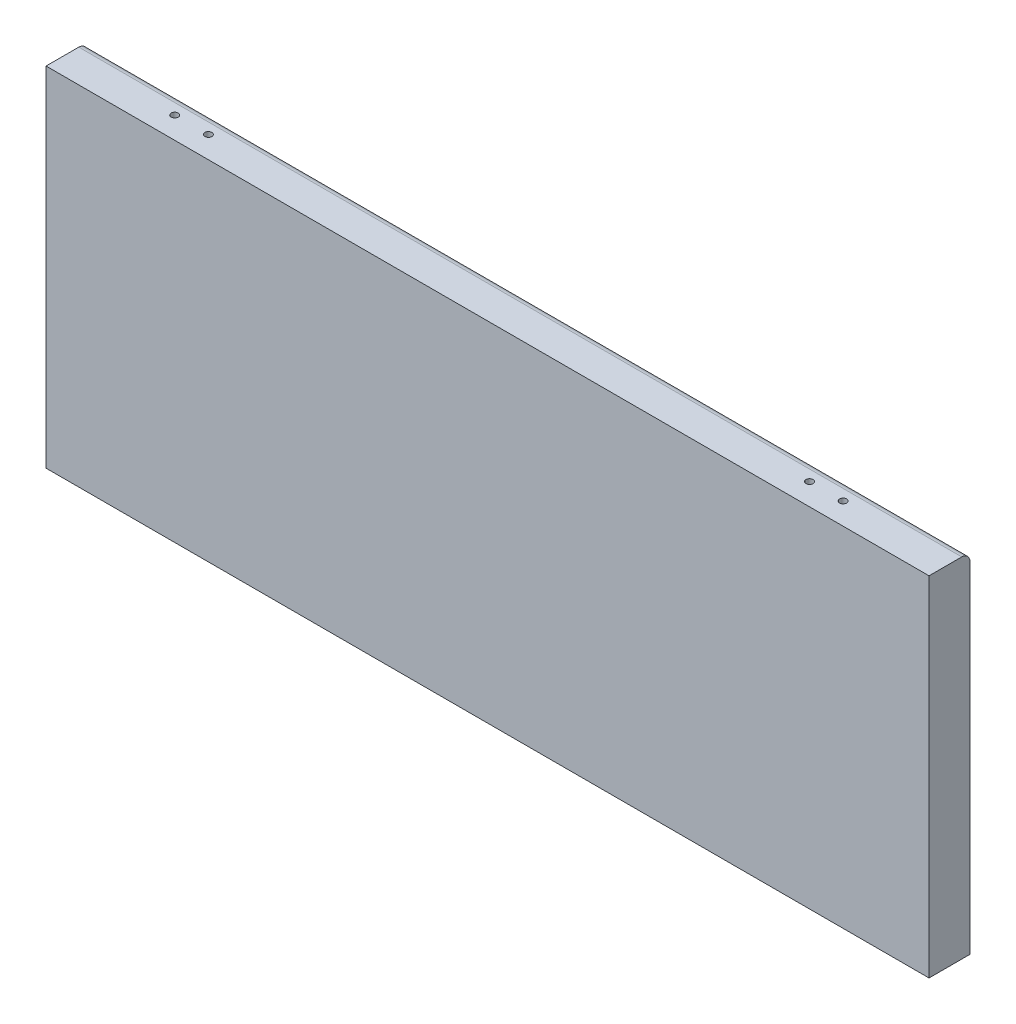
ISO-10303-21;
HEADER;
FILE_DESCRIPTION(('STEP AP214'),'2;1');
FILE_NAME('part.step','',(''),(''),'','','');
FILE_SCHEMA(('AUTOMOTIVE_DESIGN { 1 0 10303 214 1 1 1 1 }'));
ENDSEC;
DATA;
#1=APPLICATION_CONTEXT('core data for automotive mechanical design processes');
#2=APPLICATION_PROTOCOL_DEFINITION('international standard','automotive_design',2000,#1);
#3=PRODUCT_CONTEXT('',#1,'mechanical');
#4=PRODUCT('Part','Part','',(#3));
#5=PRODUCT_RELATED_PRODUCT_CATEGORY('part','',(#4));
#6=PRODUCT_DEFINITION_FORMATION('','',#4);
#7=PRODUCT_DEFINITION_CONTEXT('part definition',#1,'design');
#8=PRODUCT_DEFINITION('design','',#6,#7);
#9=PRODUCT_DEFINITION_SHAPE('','',#8);
#10=(LENGTH_UNIT() NAMED_UNIT(*) SI_UNIT(.MILLI.,.METRE.));
#11=(NAMED_UNIT(*) PLANE_ANGLE_UNIT() SI_UNIT($,.RADIAN.));
#12=(NAMED_UNIT(*) SI_UNIT($,.STERADIAN.) SOLID_ANGLE_UNIT());
#13=UNCERTAINTY_MEASURE_WITH_UNIT(LENGTH_MEASURE(1.E-05),#10,'distance_accuracy_value','');
#14=(GEOMETRIC_REPRESENTATION_CONTEXT(3) GLOBAL_UNCERTAINTY_ASSIGNED_CONTEXT((#13)) GLOBAL_UNIT_ASSIGNED_CONTEXT((#10,
#11,#12)) REPRESENTATION_CONTEXT('',''));
#15=CARTESIAN_POINT('',(0.,0.,0.));
#16=DIRECTION('',(0.,0.,1.));
#17=DIRECTION('',(1.,0.,0.));
#18=AXIS2_PLACEMENT_3D('',#15,#16,#17);
#19=CARTESIAN_POINT('',(358.321339930758,127.712624425195,-76.));
#20=DIRECTION('',(-1.,0.,0.));
#21=DIRECTION('',(0.,0.,1.));
#22=AXIS2_PLACEMENT_3D('',#19,#20,#21);
#23=PLANE('',#22);
#24=DIRECTION('',(0.,1.,0.));
#25=VECTOR('',#24,1.);
#26=CARTESIAN_POINT('',(358.321339930758,127.712624425195,-91.));
#27=LINE('',#26,#25);
#28=CARTESIAN_POINT('',(358.321339930758,0.,-91.));
#29=VERTEX_POINT('',#28);
#30=CARTESIAN_POINT('',(358.321339930758,124.712624425195,-91.));
#31=VERTEX_POINT('',#30);
#32=EDGE_CURVE('E150',#29,#31,#27,.T.);
#33=ORIENTED_EDGE('',*,*,#32,.T.);
#34=CARTESIAN_POINT('',(358.321339930758,124.712624425195,-88.));
#35=DIRECTION('',(-1.,0.,0.));
#36=DIRECTION('',(0.,0.,1.));
#37=AXIS2_PLACEMENT_3D('',#34,#35,#36);
#38=CIRCLE('',#37,3.);
#39=CARTESIAN_POINT('',(358.321339930758,127.712624425195,-88.));
#40=VERTEX_POINT('',#39);
#41=EDGE_CURVE('E11',#31,#40,#38,.F.);
#42=ORIENTED_EDGE('',*,*,#41,.T.);
#43=DIRECTION('',(0.,0.,-1.));
#44=VECTOR('',#43,1.);
#45=CARTESIAN_POINT('',(358.321339930758,127.712624425195,-76.));
#46=LINE('',#45,#44);
#47=CARTESIAN_POINT('',(358.321339930758,127.712624425195,-76.));
#48=VERTEX_POINT('',#47);
#49=EDGE_CURVE('E168',#48,#40,#46,.T.);
#50=ORIENTED_EDGE('',*,*,#49,.F.);
#51=DIRECTION('',(0.,1.,0.));
#52=VECTOR('',#51,1.);
#53=CARTESIAN_POINT('',(358.321339930758,127.712624425195,-76.));
#54=LINE('',#53,#52);
#55=CARTESIAN_POINT('',(358.321339930758,0.,-76.));
#56=VERTEX_POINT('',#55);
#57=EDGE_CURVE('E152',#56,#48,#54,.T.);
#58=ORIENTED_EDGE('',*,*,#57,.F.);
#59=DIRECTION('',(0.,0.,-1.));
#60=VECTOR('',#59,1.);
#61=CARTESIAN_POINT('',(358.321339930758,0.,-76.));
#62=LINE('',#61,#60);
#63=EDGE_CURVE('E161',#56,#29,#62,.T.);
#64=ORIENTED_EDGE('',*,*,#63,.T.);
#65=EDGE_LOOP('',(#33,#42,#50,#58,#64));
#66=FACE_BOUND('',#65,.T.);
#67=ADVANCED_FACE('F33',(#66),#23,.F.);
#68=CARTESIAN_POINT('',(358.321339930758,127.712624425195,-76.));
#69=DIRECTION('',(0.,-1.,0.));
#70=DIRECTION('',(0.,0.,-1.));
#71=AXIS2_PLACEMENT_3D('',#68,#69,#70);
#72=PLANE('',#71);
#73=CARTESIAN_POINT('',(318.821789930758,127.712624425195,-84.0152305377362));
#74=DIRECTION('',(0.,1.,0.));
#75=DIRECTION('',(0.,0.,1.));
#76=AXIS2_PLACEMENT_3D('',#73,#74,#75);
#77=CIRCLE('',#76,1.29986999999999);
#78=CARTESIAN_POINT('',(318.821789930758,127.712624425195,-82.7153605377362));
#79=VERTEX_POINT('',#78);
#80=EDGE_CURVE('E291',#79,#79,#77,.T.);
#81=ORIENTED_EDGE('',*,*,#80,.F.);
#82=EDGE_LOOP('',(#81));
#83=FACE_BOUND('',#82,.T.);
#84=CARTESIAN_POINT('',(73.73825,127.712624425195,-84.0152305377362));
#85=DIRECTION('',(0.,1.,0.));
#86=DIRECTION('',(0.,0.,1.));
#87=AXIS2_PLACEMENT_3D('',#84,#85,#86);
#88=CIRCLE('',#87,1.29986999999999);
#89=CARTESIAN_POINT('',(73.73825,127.712624425195,-82.7153605377362));
#90=VERTEX_POINT('',#89);
#91=EDGE_CURVE('E288',#90,#90,#88,.T.);
#92=ORIENTED_EDGE('',*,*,#91,.F.);
#93=EDGE_LOOP('',(#92));
#94=FACE_BOUND('',#93,.T.);
#95=CARTESIAN_POINT('',(86.07035,127.712624425195,-84.0152305377362));
#96=DIRECTION('',(0.,1.,0.));
#97=DIRECTION('',(0.,0.,1.));
#98=AXIS2_PLACEMENT_3D('',#95,#96,#97);
#99=CIRCLE('',#98,1.29986999999999);
#100=CARTESIAN_POINT('',(86.07035,127.712624425195,-82.7153605377362));
#101=VERTEX_POINT('',#100);
#102=EDGE_CURVE('E280',#101,#101,#99,.T.);
#103=ORIENTED_EDGE('',*,*,#102,.F.);
#104=EDGE_LOOP('',(#103));
#105=FACE_BOUND('',#104,.T.);
#106=CARTESIAN_POINT('',(306.489689930758,127.712624425195,-84.0152305377362));
#107=DIRECTION('',(0.,1.,0.));
#108=DIRECTION('',(0.,0.,1.));
#109=AXIS2_PLACEMENT_3D('',#106,#107,#108);
#110=CIRCLE('',#109,1.29986999999999);
#111=CARTESIAN_POINT('',(306.489689930758,127.712624425195,-82.7153605377362));
#112=VERTEX_POINT('',#111);
#113=EDGE_CURVE('E188',#112,#112,#110,.T.);
#114=ORIENTED_EDGE('',*,*,#113,.F.);
#115=EDGE_LOOP('',(#114));
#116=FACE_BOUND('',#115,.T.);
#117=ORIENTED_EDGE('',*,*,#49,.T.);
#118=DIRECTION('',(-1.,0.,0.));
#119=VECTOR('',#118,1.);
#120=CARTESIAN_POINT('',(358.321339930758,127.712624425195,-88.));
#121=LINE('',#120,#119);
#122=CARTESIAN_POINT('',(34.5719999999999,127.712624425195,-88.));
#123=VERTEX_POINT('',#122);
#124=EDGE_CURVE('E180',#40,#123,#121,.T.);
#125=ORIENTED_EDGE('',*,*,#124,.T.);
#126=DIRECTION('',(0.,0.,-1.));
#127=VECTOR('',#126,1.);
#128=CARTESIAN_POINT('',(34.5719999999999,127.712624425195,-76.));
#129=LINE('',#128,#127);
#130=CARTESIAN_POINT('',(34.5719999999999,127.712624425195,-76.));
#131=VERTEX_POINT('',#130);
#132=EDGE_CURVE('E166',#131,#123,#129,.T.);
#133=ORIENTED_EDGE('',*,*,#132,.F.);
#134=DIRECTION('',(-1.,0.,0.));
#135=VECTOR('',#134,1.);
#136=CARTESIAN_POINT('',(358.321339930758,127.712624425195,-76.));
#137=LINE('',#136,#135);
#138=EDGE_CURVE('E155',#48,#131,#137,.T.);
#139=ORIENTED_EDGE('',*,*,#138,.F.);
#140=EDGE_LOOP('',(#117,#125,#133,#139));
#141=FACE_BOUND('',#140,.T.);
#142=ADVANCED_FACE('F202',(#83,#94,#105,#116,#141),#72,.F.);
#143=CARTESIAN_POINT('',(34.5719999999999,127.712624425195,-76.));
#144=DIRECTION('',(1.,0.,0.));
#145=DIRECTION('',(0.,0.,-1.));
#146=AXIS2_PLACEMENT_3D('',#143,#144,#145);
#147=PLANE('',#146);
#148=ORIENTED_EDGE('',*,*,#132,.T.);
#149=CARTESIAN_POINT('',(34.5719999999999,124.712624425195,-88.));
#150=DIRECTION('',(1.,0.,0.));
#151=DIRECTION('',(0.,0.,-1.));
#152=AXIS2_PLACEMENT_3D('',#149,#150,#151);
#153=CIRCLE('',#152,3.);
#154=CARTESIAN_POINT('',(34.5719999999999,124.712624425195,-91.));
#155=VERTEX_POINT('',#154);
#156=EDGE_CURVE('E55',#123,#155,#153,.F.);
#157=ORIENTED_EDGE('',*,*,#156,.T.);
#158=DIRECTION('',(0.,-1.,0.));
#159=VECTOR('',#158,1.);
#160=CARTESIAN_POINT('',(34.5719999999999,127.712624425195,-91.));
#161=LINE('',#160,#159);
#162=CARTESIAN_POINT('',(34.5719999999999,0.,-91.));
#163=VERTEX_POINT('',#162);
#164=EDGE_CURVE('E141',#155,#163,#161,.T.);
#165=ORIENTED_EDGE('',*,*,#164,.T.);
#166=DIRECTION('',(0.,0.,-1.));
#167=VECTOR('',#166,1.);
#168=CARTESIAN_POINT('',(34.5719999999999,0.,-76.));
#169=LINE('',#168,#167);
#170=CARTESIAN_POINT('',(34.5719999999999,0.,-76.));
#171=VERTEX_POINT('',#170);
#172=EDGE_CURVE('E163',#171,#163,#169,.T.);
#173=ORIENTED_EDGE('',*,*,#172,.F.);
#174=DIRECTION('',(0.,-1.,0.));
#175=VECTOR('',#174,1.);
#176=CARTESIAN_POINT('',(34.5719999999999,127.712624425195,-76.));
#177=LINE('',#176,#175);
#178=EDGE_CURVE('E157',#131,#171,#177,.T.);
#179=ORIENTED_EDGE('',*,*,#178,.F.);
#180=EDGE_LOOP('',(#148,#157,#165,#173,#179));
#181=FACE_BOUND('',#180,.T.);
#182=ADVANCED_FACE('F207',(#181),#147,.F.);
#183=CARTESIAN_POINT('',(358.321339930758,0.,-76.));
#184=DIRECTION('',(0.,1.,0.));
#185=DIRECTION('',(0.,0.,1.));
#186=AXIS2_PLACEMENT_3D('',#183,#184,#185);
#187=PLANE('',#186);
#188=CARTESIAN_POINT('',(207.946669965379,0.,-84.5));
#189=DIRECTION('',(0.,-1.,0.));
#190=DIRECTION('',(0.,0.,-1.));
#191=AXIS2_PLACEMENT_3D('',#188,#189,#190);
#192=CIRCLE('',#191,1.54999999999999);
#193=CARTESIAN_POINT('',(207.946669965379,0.,-86.05));
#194=VERTEX_POINT('',#193);
#195=EDGE_CURVE('E182',#194,#194,#192,.T.);
#196=ORIENTED_EDGE('',*,*,#195,.F.);
#197=EDGE_LOOP('',(#196));
#198=FACE_BOUND('',#197,.T.);
#199=CARTESIAN_POINT('',(184.946669965379,0.,-84.5));
#200=DIRECTION('',(0.,-1.,0.));
#201=DIRECTION('',(0.,0.,-1.));
#202=AXIS2_PLACEMENT_3D('',#199,#200,#201);
#203=CIRCLE('',#202,1.54999999999999);
#204=CARTESIAN_POINT('',(184.946669965379,0.,-86.05));
#205=VERTEX_POINT('',#204);
#206=EDGE_CURVE('E134',#205,#205,#203,.T.);
#207=ORIENTED_EDGE('',*,*,#206,.F.);
#208=EDGE_LOOP('',(#207));
#209=FACE_BOUND('',#208,.T.);
#210=ORIENTED_EDGE('',*,*,#172,.T.);
#211=DIRECTION('',(1.,0.,0.));
#212=VECTOR('',#211,1.);
#213=CARTESIAN_POINT('',(34.5719999999999,0.,-91.));
#214=LINE('',#213,#212);
#215=EDGE_CURVE('E147',#163,#29,#214,.T.);
#216=ORIENTED_EDGE('',*,*,#215,.T.);
#217=ORIENTED_EDGE('',*,*,#63,.F.);
#218=DIRECTION('',(1.,0.,0.));
#219=VECTOR('',#218,1.);
#220=CARTESIAN_POINT('',(358.321339930758,0.,-76.));
#221=LINE('',#220,#219);
#222=EDGE_CURVE('E159',#171,#56,#221,.T.);
#223=ORIENTED_EDGE('',*,*,#222,.F.);
#224=EDGE_LOOP('',(#210,#216,#217,#223));
#225=FACE_BOUND('',#224,.T.);
#226=ADVANCED_FACE('F232',(#198,#209,#225),#187,.F.);
#227=CARTESIAN_POINT('',(0.,0.,-76.));
#228=DIRECTION('',(0.,0.,-1.));
#229=DIRECTION('',(-1.,0.,0.));
#230=AXIS2_PLACEMENT_3D('',#227,#228,#229);
#231=PLANE('',#230);
#232=ORIENTED_EDGE('',*,*,#57,.T.);
#233=ORIENTED_EDGE('',*,*,#138,.T.);
#234=ORIENTED_EDGE('',*,*,#178,.T.);
#235=ORIENTED_EDGE('',*,*,#222,.T.);
#236=EDGE_LOOP('',(#232,#233,#234,#235));
#237=FACE_BOUND('',#236,.T.);
#238=ADVANCED_FACE('F211',(#237),#231,.F.);
#239=CARTESIAN_POINT('',(0.,0.,-91.));
#240=DIRECTION('',(0.,0.,1.));
#241=DIRECTION('',(1.,0.,0.));
#242=AXIS2_PLACEMENT_3D('',#239,#240,#241);
#243=PLANE('',#242);
#244=DIRECTION('',(-1.,0.,0.));
#245=VECTOR('',#244,1.);
#246=CARTESIAN_POINT('',(38.5719999999999,123.712624425195,-91.));
#247=LINE('',#246,#245);
#248=CARTESIAN_POINT('',(354.321339930758,123.712624425195,-91.));
#249=VERTEX_POINT('',#248);
#250=CARTESIAN_POINT('',(38.5719999999999,123.712624425195,-91.));
#251=VERTEX_POINT('',#250);
#252=EDGE_CURVE('E115',#249,#251,#247,.T.);
#253=ORIENTED_EDGE('',*,*,#252,.T.);
#254=DIRECTION('',(0.,-1.,0.));
#255=VECTOR('',#254,1.);
#256=CARTESIAN_POINT('',(38.5719999999999,123.712624425195,-91.));
#257=LINE('',#256,#255);
#258=CARTESIAN_POINT('',(38.5719999999999,4.,-91.));
#259=VERTEX_POINT('',#258);
#260=EDGE_CURVE('E108',#251,#259,#257,.T.);
#261=ORIENTED_EDGE('',*,*,#260,.T.);
#262=DIRECTION('',(1.,0.,0.));
#263=VECTOR('',#262,1.);
#264=CARTESIAN_POINT('',(38.5719999999999,4.,-91.));
#265=LINE('',#264,#263);
#266=CARTESIAN_POINT('',(354.321339930758,4.,-91.));
#267=VERTEX_POINT('',#266);
#268=EDGE_CURVE('E119',#259,#267,#265,.T.);
#269=ORIENTED_EDGE('',*,*,#268,.T.);
#270=DIRECTION('',(0.,1.,0.));
#271=VECTOR('',#270,1.);
#272=CARTESIAN_POINT('',(354.321339930758,123.712624425195,-91.));
#273=LINE('',#272,#271);
#274=EDGE_CURVE('E124',#267,#249,#273,.T.);
#275=ORIENTED_EDGE('',*,*,#274,.T.);
#276=EDGE_LOOP('',(#253,#261,#269,#275));
#277=FACE_BOUND('',#276,.T.);
#278=ORIENTED_EDGE('',*,*,#164,.F.);
#279=DIRECTION('',(-1.,0.,0.));
#280=VECTOR('',#279,1.);
#281=CARTESIAN_POINT('',(0.,124.712624425195,-91.));
#282=LINE('',#281,#280);
#283=EDGE_CURVE('E41',#155,#31,#282,.F.);
#284=ORIENTED_EDGE('',*,*,#283,.T.);
#285=ORIENTED_EDGE('',*,*,#32,.F.);
#286=ORIENTED_EDGE('',*,*,#215,.F.);
#287=EDGE_LOOP('',(#278,#284,#285,#286));
#288=FACE_BOUND('',#287,.T.);
#289=ADVANCED_FACE('F126',(#277,#288),#243,.F.);
#290=CARTESIAN_POINT('',(38.5719999999999,123.712624425195,-91.));
#291=DIRECTION('',(-1.,0.,0.));
#292=DIRECTION('',(0.,-1.,0.));
#293=AXIS2_PLACEMENT_3D('',#290,#291,#292);
#294=PLANE('',#293);
#295=DIRECTION('',(0.,1.,0.));
#296=VECTOR('',#295,1.);
#297=CARTESIAN_POINT('',(38.5719999999999,0.,-80.));
#298=LINE('',#297,#296);
#299=CARTESIAN_POINT('',(38.5719999999999,4.,-80.));
#300=VERTEX_POINT('',#299);
#301=CARTESIAN_POINT('',(38.5719999999999,123.712624425195,-80.));
#302=VERTEX_POINT('',#301);
#303=EDGE_CURVE('E111',#300,#302,#298,.T.);
#304=ORIENTED_EDGE('',*,*,#303,.F.);
#305=DIRECTION('',(0.,0.,1.));
#306=VECTOR('',#305,1.);
#307=CARTESIAN_POINT('',(38.5719999999999,4.,-91.));
#308=LINE('',#307,#306);
#309=EDGE_CURVE('E103',#259,#300,#308,.T.);
#310=ORIENTED_EDGE('',*,*,#309,.F.);
#311=ORIENTED_EDGE('',*,*,#260,.F.);
#312=DIRECTION('',(0.,0.,1.));
#313=VECTOR('',#312,1.);
#314=CARTESIAN_POINT('',(38.5719999999999,123.712624425195,-91.));
#315=LINE('',#314,#313);
#316=EDGE_CURVE('E139',#251,#302,#315,.T.);
#317=ORIENTED_EDGE('',*,*,#316,.T.);
#318=EDGE_LOOP('',(#304,#310,#311,#317));
#319=FACE_BOUND('',#318,.T.);
#320=ADVANCED_FACE('F105',(#319),#294,.F.);
#321=CARTESIAN_POINT('',(38.5719999999999,123.712624425195,-91.));
#322=DIRECTION('',(0.,1.,0.));
#323=DIRECTION('',(0.,0.,1.));
#324=AXIS2_PLACEMENT_3D('',#321,#322,#323);
#325=PLANE('',#324);
#326=CARTESIAN_POINT('',(318.821789930758,123.712624425195,-84.0152305377362));
#327=DIRECTION('',(0.,1.,0.));
#328=DIRECTION('',(0.,0.,1.));
#329=AXIS2_PLACEMENT_3D('',#326,#327,#328);
#330=CIRCLE('',#329,1.29986999999999);
#331=CARTESIAN_POINT('',(318.821789930758,123.712624425195,-82.7153605377362));
#332=VERTEX_POINT('',#331);
#333=EDGE_CURVE('E194',#332,#332,#330,.T.);
#334=ORIENTED_EDGE('',*,*,#333,.T.);
#335=EDGE_LOOP('',(#334));
#336=FACE_BOUND('',#335,.T.);
#337=CARTESIAN_POINT('',(73.73825,123.712624425195,-84.0152305377362));
#338=DIRECTION('',(0.,1.,0.));
#339=DIRECTION('',(0.,0.,1.));
#340=AXIS2_PLACEMENT_3D('',#337,#338,#339);
#341=CIRCLE('',#340,1.29986999999999);
#342=CARTESIAN_POINT('',(73.73825,123.712624425195,-82.7153605377362));
#343=VERTEX_POINT('',#342);
#344=EDGE_CURVE('E191',#343,#343,#341,.T.);
#345=ORIENTED_EDGE('',*,*,#344,.T.);
#346=EDGE_LOOP('',(#345));
#347=FACE_BOUND('',#346,.T.);
#348=CARTESIAN_POINT('',(86.07035,123.712624425195,-84.0152305377362));
#349=DIRECTION('',(0.,1.,0.));
#350=DIRECTION('',(0.,0.,1.));
#351=AXIS2_PLACEMENT_3D('',#348,#349,#350);
#352=CIRCLE('',#351,1.29986999999999);
#353=CARTESIAN_POINT('',(86.07035,123.712624425195,-82.7153605377362));
#354=VERTEX_POINT('',#353);
#355=EDGE_CURVE('E187',#354,#354,#352,.T.);
#356=ORIENTED_EDGE('',*,*,#355,.T.);
#357=EDGE_LOOP('',(#356));
#358=FACE_BOUND('',#357,.T.);
#359=CARTESIAN_POINT('',(306.489689930758,123.712624425195,-84.0152305377362));
#360=DIRECTION('',(0.,1.,0.));
#361=DIRECTION('',(0.,0.,1.));
#362=AXIS2_PLACEMENT_3D('',#359,#360,#361);
#363=CIRCLE('',#362,1.29986999999999);
#364=CARTESIAN_POINT('',(306.489689930758,123.712624425195,-82.7153605377362));
#365=VERTEX_POINT('',#364);
#366=EDGE_CURVE('E184',#365,#365,#363,.T.);
#367=ORIENTED_EDGE('',*,*,#366,.T.);
#368=EDGE_LOOP('',(#367));
#369=FACE_BOUND('',#368,.T.);
#370=DIRECTION('',(1.,0.,0.));
#371=VECTOR('',#370,1.);
#372=CARTESIAN_POINT('',(0.,123.712624425195,-80.));
#373=LINE('',#372,#371);
#374=CARTESIAN_POINT('',(354.321339930758,123.712624425195,-80.));
#375=VERTEX_POINT('',#374);
#376=EDGE_CURVE('E176',#302,#375,#373,.T.);
#377=ORIENTED_EDGE('',*,*,#376,.F.);
#378=ORIENTED_EDGE('',*,*,#316,.F.);
#379=ORIENTED_EDGE('',*,*,#252,.F.);
#380=DIRECTION('',(0.,0.,1.));
#381=VECTOR('',#380,1.);
#382=CARTESIAN_POINT('',(354.321339930758,123.712624425195,-91.));
#383=LINE('',#382,#381);
#384=EDGE_CURVE('E142',#249,#375,#383,.T.);
#385=ORIENTED_EDGE('',*,*,#384,.T.);
#386=EDGE_LOOP('',(#377,#378,#379,#385));
#387=FACE_BOUND('',#386,.T.);
#388=ADVANCED_FACE('F247',(#336,#347,#358,#369,#387),#325,.F.);
#389=CARTESIAN_POINT('',(354.321339930758,123.712624425195,-91.));
#390=DIRECTION('',(1.,0.,0.));
#391=DIRECTION('',(0.,0.,-1.));
#392=AXIS2_PLACEMENT_3D('',#389,#390,#391);
#393=PLANE('',#392);
#394=DIRECTION('',(0.,-1.,0.));
#395=VECTOR('',#394,1.);
#396=CARTESIAN_POINT('',(354.321339930758,0.,-80.));
#397=LINE('',#396,#395);
#398=CARTESIAN_POINT('',(354.321339930758,4.,-80.));
#399=VERTEX_POINT('',#398);
#400=EDGE_CURVE('E173',#375,#399,#397,.T.);
#401=ORIENTED_EDGE('',*,*,#400,.F.);
#402=ORIENTED_EDGE('',*,*,#384,.F.);
#403=ORIENTED_EDGE('',*,*,#274,.F.);
#404=DIRECTION('',(0.,0.,1.));
#405=VECTOR('',#404,1.);
#406=CARTESIAN_POINT('',(354.321339930758,4.,-91.));
#407=LINE('',#406,#405);
#408=EDGE_CURVE('E114',#267,#399,#407,.T.);
#409=ORIENTED_EDGE('',*,*,#408,.T.);
#410=EDGE_LOOP('',(#401,#402,#403,#409));
#411=FACE_BOUND('',#410,.T.);
#412=ADVANCED_FACE('F250',(#411),#393,.F.);
#413=CARTESIAN_POINT('',(38.5719999999999,4.,-91.));
#414=DIRECTION('',(0.,-1.,0.));
#415=DIRECTION('',(0.,0.,-1.));
#416=AXIS2_PLACEMENT_3D('',#413,#414,#415);
#417=PLANE('',#416);
#418=CARTESIAN_POINT('',(207.946669965379,4.,-84.5));
#419=DIRECTION('',(0.,-1.,0.));
#420=DIRECTION('',(0.,0.,-1.));
#421=AXIS2_PLACEMENT_3D('',#418,#419,#420);
#422=CIRCLE('',#421,1.54999999999999);
#423=CARTESIAN_POINT('',(207.946669965379,4.,-86.05));
#424=VERTEX_POINT('',#423);
#425=EDGE_CURVE('E128',#424,#424,#422,.T.);
#426=ORIENTED_EDGE('',*,*,#425,.T.);
#427=EDGE_LOOP('',(#426));
#428=FACE_BOUND('',#427,.T.);
#429=CARTESIAN_POINT('',(184.946669965379,4.,-84.5));
#430=DIRECTION('',(0.,-1.,0.));
#431=DIRECTION('',(0.,0.,-1.));
#432=AXIS2_PLACEMENT_3D('',#429,#430,#431);
#433=CIRCLE('',#432,1.54999999999999);
#434=CARTESIAN_POINT('',(184.946669965379,4.,-86.05));
#435=VERTEX_POINT('',#434);
#436=EDGE_CURVE('E131',#435,#435,#433,.T.);
#437=ORIENTED_EDGE('',*,*,#436,.T.);
#438=EDGE_LOOP('',(#437));
#439=FACE_BOUND('',#438,.T.);
#440=DIRECTION('',(-1.,0.,0.));
#441=VECTOR('',#440,1.);
#442=CARTESIAN_POINT('',(0.,4.,-80.));
#443=LINE('',#442,#441);
#444=EDGE_CURVE('E171',#399,#300,#443,.T.);
#445=ORIENTED_EDGE('',*,*,#444,.F.);
#446=ORIENTED_EDGE('',*,*,#408,.F.);
#447=ORIENTED_EDGE('',*,*,#268,.F.);
#448=ORIENTED_EDGE('',*,*,#309,.T.);
#449=EDGE_LOOP('',(#445,#446,#447,#448));
#450=FACE_BOUND('',#449,.T.);
#451=ADVANCED_FACE('F120',(#428,#439,#450),#417,.F.);
#452=CARTESIAN_POINT('',(0.,0.,-80.));
#453=DIRECTION('',(0.,0.,-1.));
#454=DIRECTION('',(-1.,0.,0.));
#455=AXIS2_PLACEMENT_3D('',#452,#453,#454);
#456=PLANE('',#455);
#457=ORIENTED_EDGE('',*,*,#444,.T.);
#458=ORIENTED_EDGE('',*,*,#303,.T.);
#459=ORIENTED_EDGE('',*,*,#376,.T.);
#460=ORIENTED_EDGE('',*,*,#400,.T.);
#461=EDGE_LOOP('',(#457,#458,#459,#460));
#462=FACE_BOUND('',#461,.T.);
#463=ADVANCED_FACE('F236',(#462),#456,.T.);
#464=CARTESIAN_POINT('',(184.946669965379,6.,-84.5));
#465=DIRECTION('',(0.,-1.,0.));
#466=DIRECTION('',(0.,0.,-1.));
#467=AXIS2_PLACEMENT_3D('',#464,#465,#466);
#468=CYLINDRICAL_SURFACE('',#467,1.54999999999999);
#469=ORIENTED_EDGE('',*,*,#206,.T.);
#470=EDGE_LOOP('',(#469));
#471=FACE_BOUND('',#470,.T.);
#472=ORIENTED_EDGE('',*,*,#436,.F.);
#473=EDGE_LOOP('',(#472));
#474=FACE_BOUND('',#473,.T.);
#475=ADVANCED_FACE('F239',(#471,#474),#468,.F.);
#476=CARTESIAN_POINT('',(207.946669965379,6.,-84.5));
#477=DIRECTION('',(0.,-1.,0.));
#478=DIRECTION('',(0.,0.,-1.));
#479=AXIS2_PLACEMENT_3D('',#476,#477,#478);
#480=CYLINDRICAL_SURFACE('',#479,1.54999999999999);
#481=ORIENTED_EDGE('',*,*,#195,.T.);
#482=EDGE_LOOP('',(#481));
#483=FACE_BOUND('',#482,.T.);
#484=ORIENTED_EDGE('',*,*,#425,.F.);
#485=EDGE_LOOP('',(#484));
#486=FACE_BOUND('',#485,.T.);
#487=ADVANCED_FACE('F260',(#483,#486),#480,.F.);
#488=CARTESIAN_POINT('',(306.489689930758,121.712624425195,-84.0152305377362));
#489=DIRECTION('',(0.,1.,0.));
#490=DIRECTION('',(0.,0.,1.));
#491=AXIS2_PLACEMENT_3D('',#488,#489,#490);
#492=CYLINDRICAL_SURFACE('',#491,1.29986999999999);
#493=ORIENTED_EDGE('',*,*,#113,.T.);
#494=EDGE_LOOP('',(#493));
#495=FACE_BOUND('',#494,.T.);
#496=ORIENTED_EDGE('',*,*,#366,.F.);
#497=EDGE_LOOP('',(#496));
#498=FACE_BOUND('',#497,.T.);
#499=ADVANCED_FACE('F264',(#495,#498),#492,.F.);
#500=CARTESIAN_POINT('',(86.07035,121.712624425195,-84.0152305377362));
#501=DIRECTION('',(0.,1.,0.));
#502=DIRECTION('',(0.,0.,1.));
#503=AXIS2_PLACEMENT_3D('',#500,#501,#502);
#504=CYLINDRICAL_SURFACE('',#503,1.29986999999999);
#505=ORIENTED_EDGE('',*,*,#102,.T.);
#506=EDGE_LOOP('',(#505));
#507=FACE_BOUND('',#506,.T.);
#508=ORIENTED_EDGE('',*,*,#355,.F.);
#509=EDGE_LOOP('',(#508));
#510=FACE_BOUND('',#509,.T.);
#511=ADVANCED_FACE('F268',(#507,#510),#504,.F.);
#512=CARTESIAN_POINT('',(73.73825,121.712624425195,-84.0152305377362));
#513=DIRECTION('',(0.,1.,0.));
#514=DIRECTION('',(0.,0.,1.));
#515=AXIS2_PLACEMENT_3D('',#512,#513,#514);
#516=CYLINDRICAL_SURFACE('',#515,1.29986999999999);
#517=ORIENTED_EDGE('',*,*,#91,.T.);
#518=EDGE_LOOP('',(#517));
#519=FACE_BOUND('',#518,.T.);
#520=ORIENTED_EDGE('',*,*,#344,.F.);
#521=EDGE_LOOP('',(#520));
#522=FACE_BOUND('',#521,.T.);
#523=ADVANCED_FACE('F220',(#519,#522),#516,.F.);
#524=CARTESIAN_POINT('',(318.821789930758,121.712624425195,-84.0152305377362));
#525=DIRECTION('',(0.,1.,0.));
#526=DIRECTION('',(0.,0.,1.));
#527=AXIS2_PLACEMENT_3D('',#524,#525,#526);
#528=CYLINDRICAL_SURFACE('',#527,1.29986999999999);
#529=ORIENTED_EDGE('',*,*,#80,.T.);
#530=EDGE_LOOP('',(#529));
#531=FACE_BOUND('',#530,.T.);
#532=ORIENTED_EDGE('',*,*,#333,.F.);
#533=EDGE_LOOP('',(#532));
#534=FACE_BOUND('',#533,.T.);
#535=ADVANCED_FACE('F216',(#531,#534),#528,.F.);
#536=CARTESIAN_POINT('',(358.321339930758,124.712624425195,-88.));
#537=DIRECTION('',(-1.,0.,0.));
#538=DIRECTION('',(0.,0.,1.));
#539=AXIS2_PLACEMENT_3D('',#536,#537,#538);
#540=CYLINDRICAL_SURFACE('',#539,3.);
#541=ORIENTED_EDGE('',*,*,#41,.F.);
#542=ORIENTED_EDGE('',*,*,#283,.F.);
#543=ORIENTED_EDGE('',*,*,#156,.F.);
#544=ORIENTED_EDGE('',*,*,#124,.F.);
#545=EDGE_LOOP('',(#541,#542,#543,#544));
#546=FACE_BOUND('',#545,.T.);
#547=ADVANCED_FACE('F35',(#546),#540,.T.);
#548=CLOSED_SHELL('',(#67,#142,#182,#226,#238,#289,#320,#388,#412,#451,#463,#475,#487,#499,#511,
#523,#535,#547));
#549=MANIFOLD_SOLID_BREP('B2',#548);
#550=ADVANCED_BREP_SHAPE_REPRESENTATION('',(#18,#549),#14);
#551=SHAPE_DEFINITION_REPRESENTATION(#9,#550);
ENDSEC;
END-ISO-10303-21;
